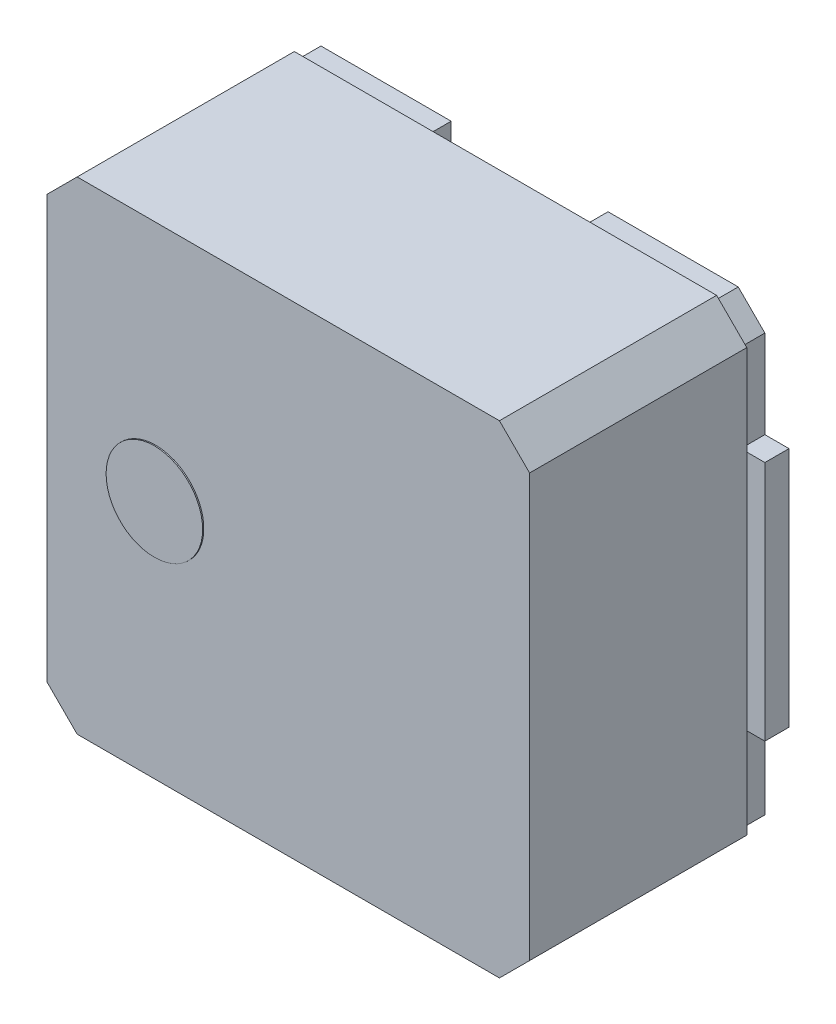
ISO-10303-21;
HEADER;
FILE_DESCRIPTION(('STEP AP214'),'2;1');
FILE_NAME('part.step','',(''),(''),'','','');
FILE_SCHEMA(('AUTOMOTIVE_DESIGN { 1 0 10303 214 1 1 1 1 }'));
ENDSEC;
DATA;
#1=APPLICATION_CONTEXT('core data for automotive mechanical design processes');
#2=APPLICATION_PROTOCOL_DEFINITION('international standard','automotive_design',2000,#1);
#3=PRODUCT_CONTEXT('',#1,'mechanical');
#4=PRODUCT('Part','Part','',(#3));
#5=PRODUCT_RELATED_PRODUCT_CATEGORY('part','',(#4));
#6=PRODUCT_DEFINITION_FORMATION('','',#4);
#7=PRODUCT_DEFINITION_CONTEXT('part definition',#1,'design');
#8=PRODUCT_DEFINITION('design','',#6,#7);
#9=PRODUCT_DEFINITION_SHAPE('','',#8);
#10=(LENGTH_UNIT() NAMED_UNIT(*) SI_UNIT(.MILLI.,.METRE.));
#11=(NAMED_UNIT(*) PLANE_ANGLE_UNIT() SI_UNIT($,.RADIAN.));
#12=(NAMED_UNIT(*) SI_UNIT($,.STERADIAN.) SOLID_ANGLE_UNIT());
#13=UNCERTAINTY_MEASURE_WITH_UNIT(LENGTH_MEASURE(1.E-05),#10,'distance_accuracy_value','');
#14=(GEOMETRIC_REPRESENTATION_CONTEXT(3) GLOBAL_UNCERTAINTY_ASSIGNED_CONTEXT((#13)) GLOBAL_UNIT_ASSIGNED_CONTEXT((#10,
#11,#12)) REPRESENTATION_CONTEXT('',''));
#15=CARTESIAN_POINT('',(0.,0.,0.));
#16=DIRECTION('',(0.,0.,1.));
#17=DIRECTION('',(1.,0.,0.));
#18=AXIS2_PLACEMENT_3D('',#15,#16,#17);
#19=CARTESIAN_POINT('',(0.,0.,0.2));
#20=DIRECTION('',(0.,0.,-1.));
#21=DIRECTION('',(-1.,0.,0.));
#22=AXIS2_PLACEMENT_3D('',#19,#20,#21);
#23=PLANE('',#22);
#24=DIRECTION('',(0.,-1.,0.));
#25=VECTOR('',#24,1.);
#26=CARTESIAN_POINT('',(-2.,-1.75,0.2));
#27=LINE('',#26,#25);
#28=CARTESIAN_POINT('',(-2.,-1.,0.2));
#29=VERTEX_POINT('',#28);
#30=CARTESIAN_POINT('',(-2.,-1.75,0.2));
#31=VERTEX_POINT('',#30);
#32=EDGE_CURVE('E408',#29,#31,#27,.T.);
#33=ORIENTED_EDGE('',*,*,#32,.F.);
#34=DIRECTION('',(-1.,0.,0.));
#35=VECTOR('',#34,1.);
#36=CARTESIAN_POINT('',(-2.15,-1.,0.2));
#37=LINE('',#36,#35);
#38=CARTESIAN_POINT('',(-1.95,-1.,0.2));
#39=VERTEX_POINT('',#38);
#40=EDGE_CURVE('E509',#39,#29,#37,.T.);
#41=ORIENTED_EDGE('',*,*,#40,.F.);
#42=DIRECTION('',(0.,1.,0.));
#43=VECTOR('',#42,1.);
#44=CARTESIAN_POINT('',(-1.95,-1.,0.2));
#45=LINE('',#44,#43);
#46=CARTESIAN_POINT('',(-1.95,-1.72928932188135,0.2));
#47=VERTEX_POINT('',#46);
#48=EDGE_CURVE('E540',#47,#39,#45,.T.);
#49=ORIENTED_EDGE('',*,*,#48,.F.);
#50=DIRECTION('',(-0.707106781186548,0.707106781186548,0.));
#51=VECTOR('',#50,1.);
#52=CARTESIAN_POINT('',(-1.95,-1.72928932188135,0.2));
#53=LINE('',#52,#51);
#54=CARTESIAN_POINT('',(-1.72928932188135,-1.95,0.2));
#55=VERTEX_POINT('',#54);
#56=EDGE_CURVE('E537',#55,#47,#53,.T.);
#57=ORIENTED_EDGE('',*,*,#56,.F.);
#58=DIRECTION('',(-1.,0.,0.));
#59=VECTOR('',#58,1.);
#60=CARTESIAN_POINT('',(-1.72928932188135,-1.95,0.2));
#61=LINE('',#60,#59);
#62=CARTESIAN_POINT('',(-0.65,-1.95,0.2));
#63=VERTEX_POINT('',#62);
#64=EDGE_CURVE('E301',#63,#55,#61,.T.);
#65=ORIENTED_EDGE('',*,*,#64,.F.);
#66=DIRECTION('',(0.,-1.,0.));
#67=VECTOR('',#66,1.);
#68=CARTESIAN_POINT('',(-0.65,1.95,0.2));
#69=LINE('',#68,#67);
#70=CARTESIAN_POINT('',(-0.65,1.95,0.2));
#71=VERTEX_POINT('',#70);
#72=EDGE_CURVE('E238',#71,#63,#69,.T.);
#73=ORIENTED_EDGE('',*,*,#72,.F.);
#74=DIRECTION('',(1.,0.,0.));
#75=VECTOR('',#74,1.);
#76=CARTESIAN_POINT('',(-0.65,1.95,0.2));
#77=LINE('',#76,#75);
#78=CARTESIAN_POINT('',(-1.72928932188135,1.95,0.2));
#79=VERTEX_POINT('',#78);
#80=EDGE_CURVE('E259',#79,#71,#77,.T.);
#81=ORIENTED_EDGE('',*,*,#80,.F.);
#82=DIRECTION('',(0.707106781186554,0.707106781186541,0.));
#83=VECTOR('',#82,1.);
#84=CARTESIAN_POINT('',(-1.72928932188135,1.95,0.2));
#85=LINE('',#84,#83);
#86=CARTESIAN_POINT('',(-1.95,1.72928932188134,0.2));
#87=VERTEX_POINT('',#86);
#88=EDGE_CURVE('E50',#87,#79,#85,.T.);
#89=ORIENTED_EDGE('',*,*,#88,.F.);
#90=DIRECTION('',(0.,1.,0.));
#91=VECTOR('',#90,1.);
#92=CARTESIAN_POINT('',(-1.95,1.72928932188134,0.2));
#93=LINE('',#92,#91);
#94=CARTESIAN_POINT('',(-1.95,1.,0.2));
#95=VERTEX_POINT('',#94);
#96=EDGE_CURVE('E523',#95,#87,#93,.T.);
#97=ORIENTED_EDGE('',*,*,#96,.F.);
#98=DIRECTION('',(-1.,0.,0.));
#99=VECTOR('',#98,1.);
#100=CARTESIAN_POINT('',(0.,1.,0.2));
#101=LINE('',#100,#99);
#102=CARTESIAN_POINT('',(-2.,1.,0.2));
#103=VERTEX_POINT('',#102);
#104=EDGE_CURVE('E43',#95,#103,#101,.T.);
#105=ORIENTED_EDGE('',*,*,#104,.T.);
#106=CARTESIAN_POINT('',(-2.,1.75,0.2));
#107=VERTEX_POINT('',#106);
#108=EDGE_CURVE('E409',#107,#103,#27,.T.);
#109=ORIENTED_EDGE('',*,*,#108,.F.);
#110=DIRECTION('',(-0.707106781186554,-0.707106781186541,0.));
#111=VECTOR('',#110,1.);
#112=CARTESIAN_POINT('',(-2.,1.75,0.2));
#113=LINE('',#112,#111);
#114=CARTESIAN_POINT('',(-1.75,2.,0.2));
#115=VERTEX_POINT('',#114);
#116=EDGE_CURVE('E406',#115,#107,#113,.T.);
#117=ORIENTED_EDGE('',*,*,#116,.F.);
#118=DIRECTION('',(-1.,0.,0.));
#119=VECTOR('',#118,1.);
#120=CARTESIAN_POINT('',(1.75,2.,0.2));
#121=LINE('',#120,#119);
#122=CARTESIAN_POINT('',(1.75,2.,0.2));
#123=VERTEX_POINT('',#122);
#124=EDGE_CURVE('E404',#123,#115,#121,.T.);
#125=ORIENTED_EDGE('',*,*,#124,.F.);
#126=DIRECTION('',(-0.707106781186554,0.707106781186541,0.));
#127=VECTOR('',#126,1.);
#128=CARTESIAN_POINT('',(2.,1.75,0.2));
#129=LINE('',#128,#127);
#130=CARTESIAN_POINT('',(2.,1.75,0.2));
#131=VERTEX_POINT('',#130);
#132=EDGE_CURVE('E330',#131,#123,#129,.T.);
#133=ORIENTED_EDGE('',*,*,#132,.F.);
#134=DIRECTION('',(0.,1.,0.));
#135=VECTOR('',#134,1.);
#136=CARTESIAN_POINT('',(2.,-1.75,0.2));
#137=LINE('',#136,#135);
#138=CARTESIAN_POINT('',(2.,1.,0.2));
#139=VERTEX_POINT('',#138);
#140=EDGE_CURVE('E419',#139,#131,#137,.T.);
#141=ORIENTED_EDGE('',*,*,#140,.F.);
#142=DIRECTION('',(1.,0.,0.));
#143=VECTOR('',#142,1.);
#144=CARTESIAN_POINT('',(1.95,1.,0.2));
#145=LINE('',#144,#143);
#146=CARTESIAN_POINT('',(1.95,1.,0.2));
#147=VERTEX_POINT('',#146);
#148=EDGE_CURVE('E307',#147,#139,#145,.T.);
#149=ORIENTED_EDGE('',*,*,#148,.F.);
#150=DIRECTION('',(0.,-1.,0.));
#151=VECTOR('',#150,1.);
#152=CARTESIAN_POINT('',(1.95,1.,0.2));
#153=LINE('',#152,#151);
#154=CARTESIAN_POINT('',(1.95,1.72928932188135,0.2));
#155=VERTEX_POINT('',#154);
#156=EDGE_CURVE('E302',#155,#147,#153,.T.);
#157=ORIENTED_EDGE('',*,*,#156,.F.);
#158=DIRECTION('',(0.707106781186554,-0.707106781186541,0.));
#159=VECTOR('',#158,1.);
#160=CARTESIAN_POINT('',(1.95,1.72928932188135,0.2));
#161=LINE('',#160,#159);
#162=CARTESIAN_POINT('',(1.72928932188135,1.95,0.2));
#163=VERTEX_POINT('',#162);
#164=EDGE_CURVE('E306',#163,#155,#161,.T.);
#165=ORIENTED_EDGE('',*,*,#164,.F.);
#166=DIRECTION('',(1.,0.,0.));
#167=VECTOR('',#166,1.);
#168=CARTESIAN_POINT('',(1.72928932188135,1.95,0.2));
#169=LINE('',#168,#167);
#170=CARTESIAN_POINT('',(0.65,1.95,0.2));
#171=VERTEX_POINT('',#170);
#172=EDGE_CURVE('E327',#171,#163,#169,.T.);
#173=ORIENTED_EDGE('',*,*,#172,.F.);
#174=DIRECTION('',(0.,1.,0.));
#175=VECTOR('',#174,1.);
#176=CARTESIAN_POINT('',(0.65,1.95,0.2));
#177=LINE('',#176,#175);
#178=CARTESIAN_POINT('',(0.65,-1.95,0.2));
#179=VERTEX_POINT('',#178);
#180=EDGE_CURVE('E324',#179,#171,#177,.T.);
#181=ORIENTED_EDGE('',*,*,#180,.F.);
#182=DIRECTION('',(-1.,0.,0.));
#183=VECTOR('',#182,1.);
#184=CARTESIAN_POINT('',(0.65,-1.95,0.2));
#185=LINE('',#184,#183);
#186=CARTESIAN_POINT('',(1.72928932188135,-1.95,0.2));
#187=VERTEX_POINT('',#186);
#188=EDGE_CURVE('E321',#187,#179,#185,.T.);
#189=ORIENTED_EDGE('',*,*,#188,.F.);
#190=DIRECTION('',(-0.707106781186548,-0.707106781186548,0.));
#191=VECTOR('',#190,1.);
#192=CARTESIAN_POINT('',(1.72928932188135,-1.95,0.2));
#193=LINE('',#192,#191);
#194=CARTESIAN_POINT('',(1.95,-1.72928932188135,0.2));
#195=VERTEX_POINT('',#194);
#196=EDGE_CURVE('E318',#195,#187,#193,.T.);
#197=ORIENTED_EDGE('',*,*,#196,.F.);
#198=DIRECTION('',(0.,-1.,0.));
#199=VECTOR('',#198,1.);
#200=CARTESIAN_POINT('',(1.95,-1.72928932188135,0.2));
#201=LINE('',#200,#199);
#202=CARTESIAN_POINT('',(1.95,-1.,0.2));
#203=VERTEX_POINT('',#202);
#204=EDGE_CURVE('E58',#203,#195,#201,.T.);
#205=ORIENTED_EDGE('',*,*,#204,.F.);
#206=DIRECTION('',(-1.,0.,0.));
#207=VECTOR('',#206,1.);
#208=CARTESIAN_POINT('',(2.15,-1.,0.2));
#209=LINE('',#208,#207);
#210=CARTESIAN_POINT('',(2.,-1.,0.2));
#211=VERTEX_POINT('',#210);
#212=EDGE_CURVE('E316',#211,#203,#209,.T.);
#213=ORIENTED_EDGE('',*,*,#212,.F.);
#214=CARTESIAN_POINT('',(2.,-1.75,0.2));
#215=VERTEX_POINT('',#214);
#216=EDGE_CURVE('E387',#215,#211,#137,.T.);
#217=ORIENTED_EDGE('',*,*,#216,.F.);
#218=DIRECTION('',(0.707106781186548,0.707106781186548,0.));
#219=VECTOR('',#218,1.);
#220=CARTESIAN_POINT('',(2.,-1.75,0.2));
#221=LINE('',#220,#219);
#222=CARTESIAN_POINT('',(1.75,-2.,0.2));
#223=VERTEX_POINT('',#222);
#224=EDGE_CURVE('E417',#223,#215,#221,.T.);
#225=ORIENTED_EDGE('',*,*,#224,.F.);
#226=DIRECTION('',(1.,0.,0.));
#227=VECTOR('',#226,1.);
#228=CARTESIAN_POINT('',(1.75,-2.,0.2));
#229=LINE('',#228,#227);
#230=CARTESIAN_POINT('',(-1.75,-2.,0.2));
#231=VERTEX_POINT('',#230);
#232=EDGE_CURVE('E415',#231,#223,#229,.T.);
#233=ORIENTED_EDGE('',*,*,#232,.F.);
#234=DIRECTION('',(0.707106781186548,-0.707106781186548,0.));
#235=VECTOR('',#234,1.);
#236=CARTESIAN_POINT('',(-2.,-1.75,0.2));
#237=LINE('',#236,#235);
#238=EDGE_CURVE('E412',#31,#231,#237,.T.);
#239=ORIENTED_EDGE('',*,*,#238,.F.);
#240=EDGE_LOOP('',(#33,#41,#49,#57,#65,#73,#81,#89,#97,#105,#109,#117,#125,#133,#141,#149,#157,
#165,#173,#181,#189,#197,#205,#213,#217,#225,#233,#239));
#241=FACE_BOUND('',#240,.T.);
#242=ADVANCED_FACE('F35',(#241),#23,.T.);
#243=CARTESIAN_POINT('',(2.,1.75,2.));
#244=DIRECTION('',(-0.707106781186541,-0.707106781186554,0.));
#245=DIRECTION('',(0.707106781186554,-0.707106781186541,0.));
#246=AXIS2_PLACEMENT_3D('',#243,#244,#245);
#247=PLANE('',#246);
#248=ORIENTED_EDGE('',*,*,#132,.T.);
#249=DIRECTION('',(0.,0.,-1.));
#250=VECTOR('',#249,1.);
#251=CARTESIAN_POINT('',(1.75,2.,2.));
#252=LINE('',#251,#250);
#253=CARTESIAN_POINT('',(1.75,2.,2.));
#254=VERTEX_POINT('',#253);
#255=EDGE_CURVE('E443',#254,#123,#252,.T.);
#256=ORIENTED_EDGE('',*,*,#255,.F.);
#257=DIRECTION('',(-0.707106781186554,0.707106781186541,0.));
#258=VECTOR('',#257,1.);
#259=CARTESIAN_POINT('',(2.,1.75,2.));
#260=LINE('',#259,#258);
#261=CARTESIAN_POINT('',(2.,1.75,2.));
#262=VERTEX_POINT('',#261);
#263=EDGE_CURVE('E383',#262,#254,#260,.T.);
#264=ORIENTED_EDGE('',*,*,#263,.F.);
#265=DIRECTION('',(0.,0.,-1.));
#266=VECTOR('',#265,1.);
#267=CARTESIAN_POINT('',(2.,1.75,2.));
#268=LINE('',#267,#266);
#269=EDGE_CURVE('E401',#262,#131,#268,.T.);
#270=ORIENTED_EDGE('',*,*,#269,.T.);
#271=EDGE_LOOP('',(#248,#256,#264,#270));
#272=FACE_BOUND('',#271,.T.);
#273=ADVANCED_FACE('F37',(#272),#247,.F.);
#274=CARTESIAN_POINT('',(1.75,2.,2.));
#275=DIRECTION('',(0.,-1.,0.));
#276=DIRECTION('',(0.,0.,-1.));
#277=AXIS2_PLACEMENT_3D('',#274,#275,#276);
#278=PLANE('',#277);
#279=ORIENTED_EDGE('',*,*,#124,.T.);
#280=DIRECTION('',(0.,0.,-1.));
#281=VECTOR('',#280,1.);
#282=CARTESIAN_POINT('',(-1.75,2.,2.));
#283=LINE('',#282,#281);
#284=CARTESIAN_POINT('',(-1.75,2.,2.));
#285=VERTEX_POINT('',#284);
#286=EDGE_CURVE('E440',#285,#115,#283,.T.);
#287=ORIENTED_EDGE('',*,*,#286,.F.);
#288=DIRECTION('',(-1.,0.,0.));
#289=VECTOR('',#288,1.);
#290=CARTESIAN_POINT('',(1.75,2.,2.));
#291=LINE('',#290,#289);
#292=EDGE_CURVE('E386',#254,#285,#291,.T.);
#293=ORIENTED_EDGE('',*,*,#292,.F.);
#294=ORIENTED_EDGE('',*,*,#255,.T.);
#295=EDGE_LOOP('',(#279,#287,#293,#294));
#296=FACE_BOUND('',#295,.T.);
#297=ADVANCED_FACE('F485',(#296),#278,.F.);
#298=CARTESIAN_POINT('',(-2.,1.75,2.));
#299=DIRECTION('',(0.707106781186541,-0.707106781186554,0.));
#300=DIRECTION('',(0.707106781186554,0.707106781186541,0.));
#301=AXIS2_PLACEMENT_3D('',#298,#299,#300);
#302=PLANE('',#301);
#303=ORIENTED_EDGE('',*,*,#116,.T.);
#304=DIRECTION('',(0.,0.,-1.));
#305=VECTOR('',#304,1.);
#306=CARTESIAN_POINT('',(-2.,1.75,2.));
#307=LINE('',#306,#305);
#308=CARTESIAN_POINT('',(-2.,1.75,2.));
#309=VERTEX_POINT('',#308);
#310=EDGE_CURVE('E437',#309,#107,#307,.T.);
#311=ORIENTED_EDGE('',*,*,#310,.F.);
#312=DIRECTION('',(-0.707106781186554,-0.707106781186541,0.));
#313=VECTOR('',#312,1.);
#314=CARTESIAN_POINT('',(-2.,1.75,2.));
#315=LINE('',#314,#313);
#316=EDGE_CURVE('E389',#285,#309,#315,.T.);
#317=ORIENTED_EDGE('',*,*,#316,.F.);
#318=ORIENTED_EDGE('',*,*,#286,.T.);
#319=EDGE_LOOP('',(#303,#311,#317,#318));
#320=FACE_BOUND('',#319,.T.);
#321=ADVANCED_FACE('F585',(#320),#302,.F.);
#322=CARTESIAN_POINT('',(-2.,-1.75,2.));
#323=DIRECTION('',(1.,0.,0.));
#324=DIRECTION('',(0.,1.,0.));
#325=AXIS2_PLACEMENT_3D('',#322,#323,#324);
#326=PLANE('',#325);
#327=ORIENTED_EDGE('',*,*,#108,.T.);
#328=EDGE_CURVE('E413',#103,#29,#27,.T.);
#329=ORIENTED_EDGE('',*,*,#328,.T.);
#330=ORIENTED_EDGE('',*,*,#32,.T.);
#331=DIRECTION('',(0.,0.,-1.));
#332=VECTOR('',#331,1.);
#333=CARTESIAN_POINT('',(-2.,-1.75,2.));
#334=LINE('',#333,#332);
#335=CARTESIAN_POINT('',(-2.,-1.75,2.));
#336=VERTEX_POINT('',#335);
#337=EDGE_CURVE('E434',#336,#31,#334,.T.);
#338=ORIENTED_EDGE('',*,*,#337,.F.);
#339=DIRECTION('',(0.,-1.,0.));
#340=VECTOR('',#339,1.);
#341=CARTESIAN_POINT('',(-2.,-1.75,2.));
#342=LINE('',#341,#340);
#343=EDGE_CURVE('E391',#309,#336,#342,.T.);
#344=ORIENTED_EDGE('',*,*,#343,.F.);
#345=ORIENTED_EDGE('',*,*,#310,.T.);
#346=EDGE_LOOP('',(#327,#329,#330,#338,#344,#345));
#347=FACE_BOUND('',#346,.T.);
#348=ADVANCED_FACE('F511',(#347),#326,.F.);
#349=CARTESIAN_POINT('',(-2.,-1.75,2.));
#350=DIRECTION('',(0.707106781186547,0.707106781186547,0.));
#351=DIRECTION('',(-0.707106781186548,0.707106781186548,0.));
#352=AXIS2_PLACEMENT_3D('',#349,#350,#351);
#353=PLANE('',#352);
#354=ORIENTED_EDGE('',*,*,#238,.T.);
#355=DIRECTION('',(0.,0.,-1.));
#356=VECTOR('',#355,1.);
#357=CARTESIAN_POINT('',(-1.75,-2.,2.));
#358=LINE('',#357,#356);
#359=CARTESIAN_POINT('',(-1.75,-2.,2.));
#360=VERTEX_POINT('',#359);
#361=EDGE_CURVE('E431',#360,#231,#358,.T.);
#362=ORIENTED_EDGE('',*,*,#361,.F.);
#363=DIRECTION('',(0.707106781186548,-0.707106781186548,0.));
#364=VECTOR('',#363,1.);
#365=CARTESIAN_POINT('',(-2.,-1.75,2.));
#366=LINE('',#365,#364);
#367=EDGE_CURVE('E393',#336,#360,#366,.T.);
#368=ORIENTED_EDGE('',*,*,#367,.F.);
#369=ORIENTED_EDGE('',*,*,#337,.T.);
#370=EDGE_LOOP('',(#354,#362,#368,#369));
#371=FACE_BOUND('',#370,.T.);
#372=ADVANCED_FACE('F503',(#371),#353,.F.);
#373=CARTESIAN_POINT('',(1.75,-2.,2.));
#374=DIRECTION('',(0.,1.,0.));
#375=DIRECTION('',(0.,0.,1.));
#376=AXIS2_PLACEMENT_3D('',#373,#374,#375);
#377=PLANE('',#376);
#378=ORIENTED_EDGE('',*,*,#232,.T.);
#379=DIRECTION('',(0.,0.,-1.));
#380=VECTOR('',#379,1.);
#381=CARTESIAN_POINT('',(1.75,-2.,2.));
#382=LINE('',#381,#380);
#383=CARTESIAN_POINT('',(1.75,-2.,2.));
#384=VERTEX_POINT('',#383);
#385=EDGE_CURVE('E428',#384,#223,#382,.T.);
#386=ORIENTED_EDGE('',*,*,#385,.F.);
#387=DIRECTION('',(1.,0.,0.));
#388=VECTOR('',#387,1.);
#389=CARTESIAN_POINT('',(1.75,-2.,2.));
#390=LINE('',#389,#388);
#391=EDGE_CURVE('E395',#360,#384,#390,.T.);
#392=ORIENTED_EDGE('',*,*,#391,.F.);
#393=ORIENTED_EDGE('',*,*,#361,.T.);
#394=EDGE_LOOP('',(#378,#386,#392,#393));
#395=FACE_BOUND('',#394,.T.);
#396=ADVANCED_FACE('F499',(#395),#377,.F.);
#397=CARTESIAN_POINT('',(2.,-1.75,2.));
#398=DIRECTION('',(-0.707106781186547,0.707106781186547,0.));
#399=DIRECTION('',(-0.707106781186548,-0.707106781186548,0.));
#400=AXIS2_PLACEMENT_3D('',#397,#398,#399);
#401=PLANE('',#400);
#402=ORIENTED_EDGE('',*,*,#224,.T.);
#403=DIRECTION('',(0.,0.,-1.));
#404=VECTOR('',#403,1.);
#405=CARTESIAN_POINT('',(2.,-1.75,2.));
#406=LINE('',#405,#404);
#407=CARTESIAN_POINT('',(2.,-1.75,2.));
#408=VERTEX_POINT('',#407);
#409=EDGE_CURVE('E425',#408,#215,#406,.T.);
#410=ORIENTED_EDGE('',*,*,#409,.F.);
#411=DIRECTION('',(0.707106781186548,0.707106781186548,0.));
#412=VECTOR('',#411,1.);
#413=CARTESIAN_POINT('',(2.,-1.75,2.));
#414=LINE('',#413,#412);
#415=EDGE_CURVE('E397',#384,#408,#414,.T.);
#416=ORIENTED_EDGE('',*,*,#415,.F.);
#417=ORIENTED_EDGE('',*,*,#385,.T.);
#418=EDGE_LOOP('',(#402,#410,#416,#417));
#419=FACE_BOUND('',#418,.T.);
#420=ADVANCED_FACE('F495',(#419),#401,.F.);
#421=CARTESIAN_POINT('',(2.,-1.75,2.));
#422=DIRECTION('',(-1.,0.,0.));
#423=DIRECTION('',(0.,-1.,0.));
#424=AXIS2_PLACEMENT_3D('',#421,#422,#423);
#425=PLANE('',#424);
#426=ORIENTED_EDGE('',*,*,#216,.T.);
#427=EDGE_CURVE('E422',#211,#139,#137,.T.);
#428=ORIENTED_EDGE('',*,*,#427,.T.);
#429=ORIENTED_EDGE('',*,*,#140,.T.);
#430=ORIENTED_EDGE('',*,*,#269,.F.);
#431=DIRECTION('',(0.,1.,0.));
#432=VECTOR('',#431,1.);
#433=CARTESIAN_POINT('',(2.,-1.75,2.));
#434=LINE('',#433,#432);
#435=EDGE_CURVE('E399',#408,#262,#434,.T.);
#436=ORIENTED_EDGE('',*,*,#435,.F.);
#437=ORIENTED_EDGE('',*,*,#409,.T.);
#438=EDGE_LOOP('',(#426,#428,#429,#430,#436,#437));
#439=FACE_BOUND('',#438,.T.);
#440=ADVANCED_FACE('F475',(#439),#425,.F.);
#441=CARTESIAN_POINT('',(0.,0.,2.));
#442=DIRECTION('',(0.,0.,-1.));
#443=DIRECTION('',(-1.,0.,0.));
#444=AXIS2_PLACEMENT_3D('',#441,#442,#443);
#445=PLANE('',#444);
#446=CARTESIAN_POINT('',(-1.1,0.,2.));
#447=DIRECTION('',(0.,0.,-1.));
#448=DIRECTION('',(-1.,0.,0.));
#449=AXIS2_PLACEMENT_3D('',#446,#447,#448);
#450=CIRCLE('',#449,0.4);
#451=CARTESIAN_POINT('',(-1.5,0.,2.));
#452=VERTEX_POINT('',#451);
#453=EDGE_CURVE('E11',#452,#452,#450,.F.);
#454=ORIENTED_EDGE('',*,*,#453,.F.);
#455=EDGE_LOOP('',(#454));
#456=FACE_BOUND('',#455,.T.);
#457=ORIENTED_EDGE('',*,*,#263,.T.);
#458=ORIENTED_EDGE('',*,*,#292,.T.);
#459=ORIENTED_EDGE('',*,*,#316,.T.);
#460=ORIENTED_EDGE('',*,*,#343,.T.);
#461=ORIENTED_EDGE('',*,*,#367,.T.);
#462=ORIENTED_EDGE('',*,*,#391,.T.);
#463=ORIENTED_EDGE('',*,*,#415,.T.);
#464=ORIENTED_EDGE('',*,*,#435,.T.);
#465=EDGE_LOOP('',(#457,#458,#459,#460,#461,#462,#463,#464));
#466=FACE_BOUND('',#465,.T.);
#467=ADVANCED_FACE('F488',(#456,#466),#445,.F.);
#468=CARTESIAN_POINT('',(0.,0.,0.));
#469=DIRECTION('',(0.,0.,1.));
#470=DIRECTION('',(1.,0.,0.));
#471=AXIS2_PLACEMENT_3D('',#468,#469,#470);
#472=PLANE('',#471);
#473=DIRECTION('',(-1.,0.,0.));
#474=VECTOR('',#473,1.);
#475=CARTESIAN_POINT('',(1.72928932188135,1.95,0.));
#476=LINE('',#475,#474);
#477=CARTESIAN_POINT('',(1.72928932188135,1.95,0.));
#478=VERTEX_POINT('',#477);
#479=CARTESIAN_POINT('',(0.65,1.95,0.));
#480=VERTEX_POINT('',#479);
#481=EDGE_CURVE('E331',#478,#480,#476,.T.);
#482=ORIENTED_EDGE('',*,*,#481,.F.);
#483=DIRECTION('',(-0.707106781186554,0.70710678118654,0.));
#484=VECTOR('',#483,1.);
#485=CARTESIAN_POINT('',(1.95,1.72928932188135,0.));
#486=LINE('',#485,#484);
#487=CARTESIAN_POINT('',(1.95,1.72928932188135,0.));
#488=VERTEX_POINT('',#487);
#489=EDGE_CURVE('E358',#488,#478,#486,.T.);
#490=ORIENTED_EDGE('',*,*,#489,.F.);
#491=DIRECTION('',(0.,1.,0.));
#492=VECTOR('',#491,1.);
#493=CARTESIAN_POINT('',(1.95,1.,0.));
#494=LINE('',#493,#492);
#495=CARTESIAN_POINT('',(1.95,1.,0.));
#496=VERTEX_POINT('',#495);
#497=EDGE_CURVE('E355',#496,#488,#494,.T.);
#498=ORIENTED_EDGE('',*,*,#497,.F.);
#499=DIRECTION('',(-1.,0.,0.));
#500=VECTOR('',#499,1.);
#501=CARTESIAN_POINT('',(1.95,1.,0.));
#502=LINE('',#501,#500);
#503=CARTESIAN_POINT('',(2.15,1.,0.));
#504=VERTEX_POINT('',#503);
#505=EDGE_CURVE('E352',#504,#496,#502,.T.);
#506=ORIENTED_EDGE('',*,*,#505,.F.);
#507=DIRECTION('',(0.,1.,0.));
#508=VECTOR('',#507,1.);
#509=CARTESIAN_POINT('',(2.15,1.,0.));
#510=LINE('',#509,#508);
#511=CARTESIAN_POINT('',(2.15,-1.,0.));
#512=VERTEX_POINT('',#511);
#513=EDGE_CURVE('E349',#512,#504,#510,.T.);
#514=ORIENTED_EDGE('',*,*,#513,.F.);
#515=DIRECTION('',(1.,0.,0.));
#516=VECTOR('',#515,1.);
#517=CARTESIAN_POINT('',(2.15,-1.,0.));
#518=LINE('',#517,#516);
#519=CARTESIAN_POINT('',(1.95,-1.,0.));
#520=VERTEX_POINT('',#519);
#521=EDGE_CURVE('E346',#520,#512,#518,.T.);
#522=ORIENTED_EDGE('',*,*,#521,.F.);
#523=DIRECTION('',(0.,1.,0.));
#524=VECTOR('',#523,1.);
#525=CARTESIAN_POINT('',(1.95,-1.72928932188135,0.));
#526=LINE('',#525,#524);
#527=CARTESIAN_POINT('',(1.95,-1.72928932188135,0.));
#528=VERTEX_POINT('',#527);
#529=EDGE_CURVE('E343',#528,#520,#526,.T.);
#530=ORIENTED_EDGE('',*,*,#529,.F.);
#531=DIRECTION('',(0.707106781186548,0.707106781186548,0.));
#532=VECTOR('',#531,1.);
#533=CARTESIAN_POINT('',(1.72928932188135,-1.95,0.));
#534=LINE('',#533,#532);
#535=CARTESIAN_POINT('',(1.72928932188135,-1.95,0.));
#536=VERTEX_POINT('',#535);
#537=EDGE_CURVE('E340',#536,#528,#534,.T.);
#538=ORIENTED_EDGE('',*,*,#537,.F.);
#539=DIRECTION('',(1.,0.,0.));
#540=VECTOR('',#539,1.);
#541=CARTESIAN_POINT('',(0.65,-1.95,0.));
#542=LINE('',#541,#540);
#543=CARTESIAN_POINT('',(0.65,-1.95,0.));
#544=VERTEX_POINT('',#543);
#545=EDGE_CURVE('E337',#544,#536,#542,.T.);
#546=ORIENTED_EDGE('',*,*,#545,.F.);
#547=DIRECTION('',(0.,-1.,0.));
#548=VECTOR('',#547,1.);
#549=CARTESIAN_POINT('',(0.65,1.95,0.));
#550=LINE('',#549,#548);
#551=EDGE_CURVE('E334',#480,#544,#550,.T.);
#552=ORIENTED_EDGE('',*,*,#551,.F.);
#553=EDGE_LOOP('',(#482,#490,#498,#506,#514,#522,#530,#538,#546,#552));
#554=FACE_BOUND('',#553,.T.);
#555=ADVANCED_FACE('F462',(#554),#472,.F.);
#556=CARTESIAN_POINT('',(1.95,1.72928932188135,4.37851648315524));
#557=DIRECTION('',(-0.707106781186541,-0.707106781186554,0.));
#558=DIRECTION('',(0.707106781186554,-0.707106781186541,0.));
#559=AXIS2_PLACEMENT_3D('',#556,#557,#558);
#560=PLANE('',#559);
#561=DIRECTION('',(0.,0.,-1.));
#562=VECTOR('',#561,1.);
#563=CARTESIAN_POINT('',(1.72928932188135,1.95,4.37851648315524));
#564=LINE('',#563,#562);
#565=EDGE_CURVE('E361',#163,#478,#564,.T.);
#566=ORIENTED_EDGE('',*,*,#565,.F.);
#567=ORIENTED_EDGE('',*,*,#164,.T.);
#568=DIRECTION('',(0.,0.,-1.));
#569=VECTOR('',#568,1.);
#570=CARTESIAN_POINT('',(1.95,1.72928932188135,4.37851648315524));
#571=LINE('',#570,#569);
#572=EDGE_CURVE('E363',#155,#488,#571,.T.);
#573=ORIENTED_EDGE('',*,*,#572,.T.);
#574=ORIENTED_EDGE('',*,*,#489,.T.);
#575=EDGE_LOOP('',(#566,#567,#573,#574));
#576=FACE_BOUND('',#575,.T.);
#577=ADVANCED_FACE('F631',(#576),#560,.F.);
#578=CARTESIAN_POINT('',(1.95,1.,4.37851648315524));
#579=DIRECTION('',(-1.,0.,0.));
#580=DIRECTION('',(0.,0.,1.));
#581=AXIS2_PLACEMENT_3D('',#578,#579,#580);
#582=PLANE('',#581);
#583=ORIENTED_EDGE('',*,*,#572,.F.);
#584=ORIENTED_EDGE('',*,*,#156,.T.);
#585=DIRECTION('',(0.,0.,-1.));
#586=VECTOR('',#585,1.);
#587=CARTESIAN_POINT('',(1.95,1.,4.37851648315524));
#588=LINE('',#587,#586);
#589=EDGE_CURVE('E365',#147,#496,#588,.T.);
#590=ORIENTED_EDGE('',*,*,#589,.T.);
#591=ORIENTED_EDGE('',*,*,#497,.T.);
#592=EDGE_LOOP('',(#583,#584,#590,#591));
#593=FACE_BOUND('',#592,.T.);
#594=ADVANCED_FACE('F638',(#593),#582,.F.);
#595=CARTESIAN_POINT('',(1.95,1.,4.37851648315524));
#596=DIRECTION('',(0.,-1.,0.));
#597=DIRECTION('',(0.,0.,-1.));
#598=AXIS2_PLACEMENT_3D('',#595,#596,#597);
#599=PLANE('',#598);
#600=ORIENTED_EDGE('',*,*,#589,.F.);
#601=ORIENTED_EDGE('',*,*,#148,.T.);
#602=CARTESIAN_POINT('',(2.15,1.,0.2));
#603=VERTEX_POINT('',#602);
#604=EDGE_CURVE('E305',#139,#603,#145,.T.);
#605=ORIENTED_EDGE('',*,*,#604,.T.);
#606=DIRECTION('',(0.,0.,-1.));
#607=VECTOR('',#606,1.);
#608=CARTESIAN_POINT('',(2.15,1.,4.37851648315524));
#609=LINE('',#608,#607);
#610=EDGE_CURVE('E367',#603,#504,#609,.T.);
#611=ORIENTED_EDGE('',*,*,#610,.T.);
#612=ORIENTED_EDGE('',*,*,#505,.T.);
#613=EDGE_LOOP('',(#600,#601,#605,#611,#612));
#614=FACE_BOUND('',#613,.T.);
#615=ADVANCED_FACE('F646',(#614),#599,.F.);
#616=CARTESIAN_POINT('',(2.15,1.,4.37851648315524));
#617=DIRECTION('',(-1.,0.,0.));
#618=DIRECTION('',(0.,0.,1.));
#619=AXIS2_PLACEMENT_3D('',#616,#617,#618);
#620=PLANE('',#619);
#621=ORIENTED_EDGE('',*,*,#610,.F.);
#622=DIRECTION('',(0.,-1.,0.));
#623=VECTOR('',#622,1.);
#624=CARTESIAN_POINT('',(2.15,1.,0.2));
#625=LINE('',#624,#623);
#626=CARTESIAN_POINT('',(2.15,-1.,0.2));
#627=VERTEX_POINT('',#626);
#628=EDGE_CURVE('E310',#603,#627,#625,.T.);
#629=ORIENTED_EDGE('',*,*,#628,.T.);
#630=DIRECTION('',(0.,0.,-1.));
#631=VECTOR('',#630,1.);
#632=CARTESIAN_POINT('',(2.15,-1.,4.37851648315524));
#633=LINE('',#632,#631);
#634=EDGE_CURVE('E369',#627,#512,#633,.T.);
#635=ORIENTED_EDGE('',*,*,#634,.T.);
#636=ORIENTED_EDGE('',*,*,#513,.T.);
#637=EDGE_LOOP('',(#621,#629,#635,#636));
#638=FACE_BOUND('',#637,.T.);
#639=ADVANCED_FACE('F467',(#638),#620,.F.);
#640=CARTESIAN_POINT('',(2.15,-1.,4.37851648315524));
#641=DIRECTION('',(0.,1.,0.));
#642=DIRECTION('',(0.,0.,1.));
#643=AXIS2_PLACEMENT_3D('',#640,#641,#642);
#644=PLANE('',#643);
#645=ORIENTED_EDGE('',*,*,#634,.F.);
#646=EDGE_CURVE('E313',#627,#211,#209,.T.);
#647=ORIENTED_EDGE('',*,*,#646,.T.);
#648=ORIENTED_EDGE('',*,*,#212,.T.);
#649=DIRECTION('',(0.,0.,-1.));
#650=VECTOR('',#649,1.);
#651=CARTESIAN_POINT('',(1.95,-1.,4.37851648315524));
#652=LINE('',#651,#650);
#653=EDGE_CURVE('E371',#203,#520,#652,.T.);
#654=ORIENTED_EDGE('',*,*,#653,.T.);
#655=ORIENTED_EDGE('',*,*,#521,.T.);
#656=EDGE_LOOP('',(#645,#647,#648,#654,#655));
#657=FACE_BOUND('',#656,.T.);
#658=ADVANCED_FACE('F451',(#657),#644,.F.);
#659=CARTESIAN_POINT('',(1.95,-1.72928932188135,4.37851648315524));
#660=DIRECTION('',(-1.,0.,0.));
#661=DIRECTION('',(0.,-1.,0.));
#662=AXIS2_PLACEMENT_3D('',#659,#660,#661);
#663=PLANE('',#662);
#664=ORIENTED_EDGE('',*,*,#653,.F.);
#665=ORIENTED_EDGE('',*,*,#204,.T.);
#666=DIRECTION('',(0.,0.,-1.));
#667=VECTOR('',#666,1.);
#668=CARTESIAN_POINT('',(1.95,-1.72928932188135,4.37851648315524));
#669=LINE('',#668,#667);
#670=EDGE_CURVE('E373',#195,#528,#669,.T.);
#671=ORIENTED_EDGE('',*,*,#670,.T.);
#672=ORIENTED_EDGE('',*,*,#529,.T.);
#673=EDGE_LOOP('',(#664,#665,#671,#672));
#674=FACE_BOUND('',#673,.T.);
#675=ADVANCED_FACE('F454',(#674),#663,.F.);
#676=CARTESIAN_POINT('',(1.72928932188135,-1.95,4.37851648315524));
#677=DIRECTION('',(-0.707106781186548,0.707106781186548,0.));
#678=DIRECTION('',(-0.707106781186548,-0.707106781186548,0.));
#679=AXIS2_PLACEMENT_3D('',#676,#677,#678);
#680=PLANE('',#679);
#681=ORIENTED_EDGE('',*,*,#670,.F.);
#682=ORIENTED_EDGE('',*,*,#196,.T.);
#683=DIRECTION('',(0.,0.,-1.));
#684=VECTOR('',#683,1.);
#685=CARTESIAN_POINT('',(1.72928932188135,-1.95,4.37851648315524));
#686=LINE('',#685,#684);
#687=EDGE_CURVE('E375',#187,#536,#686,.T.);
#688=ORIENTED_EDGE('',*,*,#687,.T.);
#689=ORIENTED_EDGE('',*,*,#537,.T.);
#690=EDGE_LOOP('',(#681,#682,#688,#689));
#691=FACE_BOUND('',#690,.T.);
#692=ADVANCED_FACE('F673',(#691),#680,.F.);
#693=CARTESIAN_POINT('',(0.65,-1.95,4.37851648315524));
#694=DIRECTION('',(0.,1.,0.));
#695=DIRECTION('',(-1.,0.,0.));
#696=AXIS2_PLACEMENT_3D('',#693,#694,#695);
#697=PLANE('',#696);
#698=ORIENTED_EDGE('',*,*,#687,.F.);
#699=ORIENTED_EDGE('',*,*,#188,.T.);
#700=DIRECTION('',(0.,0.,-1.));
#701=VECTOR('',#700,1.);
#702=CARTESIAN_POINT('',(0.65,-1.95,4.37851648315524));
#703=LINE('',#702,#701);
#704=EDGE_CURVE('E377',#179,#544,#703,.T.);
#705=ORIENTED_EDGE('',*,*,#704,.T.);
#706=ORIENTED_EDGE('',*,*,#545,.T.);
#707=EDGE_LOOP('',(#698,#699,#705,#706));
#708=FACE_BOUND('',#707,.T.);
#709=ADVANCED_FACE('F680',(#708),#697,.F.);
#710=CARTESIAN_POINT('',(0.65,1.95,4.37851648315524));
#711=DIRECTION('',(1.,0.,0.));
#712=DIRECTION('',(0.,1.,0.));
#713=AXIS2_PLACEMENT_3D('',#710,#711,#712);
#714=PLANE('',#713);
#715=ORIENTED_EDGE('',*,*,#704,.F.);
#716=ORIENTED_EDGE('',*,*,#180,.T.);
#717=DIRECTION('',(0.,0.,-1.));
#718=VECTOR('',#717,1.);
#719=CARTESIAN_POINT('',(0.65,1.95,4.37851648315524));
#720=LINE('',#719,#718);
#721=EDGE_CURVE('E379',#171,#480,#720,.T.);
#722=ORIENTED_EDGE('',*,*,#721,.T.);
#723=ORIENTED_EDGE('',*,*,#551,.T.);
#724=EDGE_LOOP('',(#715,#716,#722,#723));
#725=FACE_BOUND('',#724,.T.);
#726=ADVANCED_FACE('F688',(#725),#714,.F.);
#727=CARTESIAN_POINT('',(1.72928932188135,1.95,4.37851648315524));
#728=DIRECTION('',(0.,-1.,0.));
#729=DIRECTION('',(1.,0.,0.));
#730=AXIS2_PLACEMENT_3D('',#727,#728,#729);
#731=PLANE('',#730);
#732=ORIENTED_EDGE('',*,*,#721,.F.);
#733=ORIENTED_EDGE('',*,*,#172,.T.);
#734=ORIENTED_EDGE('',*,*,#565,.T.);
#735=ORIENTED_EDGE('',*,*,#481,.T.);
#736=EDGE_LOOP('',(#732,#733,#734,#735));
#737=FACE_BOUND('',#736,.T.);
#738=ADVANCED_FACE('F696',(#737),#731,.F.);
#739=CARTESIAN_POINT('',(0.,0.,0.2));
#740=DIRECTION('',(0.,0.,-1.));
#741=DIRECTION('',(-1.,0.,0.));
#742=AXIS2_PLACEMENT_3D('',#739,#740,#741);
#743=PLANE('',#742);
#744=ORIENTED_EDGE('',*,*,#427,.F.);
#745=ORIENTED_EDGE('',*,*,#646,.F.);
#746=ORIENTED_EDGE('',*,*,#628,.F.);
#747=ORIENTED_EDGE('',*,*,#604,.F.);
#748=EDGE_LOOP('',(#744,#745,#746,#747));
#749=FACE_BOUND('',#748,.T.);
#750=ADVANCED_FACE('F471',(#749),#743,.F.);
#751=CARTESIAN_POINT('',(0.,0.,0.2));
#752=DIRECTION('',(0.,0.,-1.));
#753=DIRECTION('',(-1.,0.,0.));
#754=AXIS2_PLACEMENT_3D('',#751,#752,#753);
#755=PLANE('',#754);
#756=CARTESIAN_POINT('',(-2.15,-1.,0.2));
#757=VERTEX_POINT('',#756);
#758=EDGE_CURVE('E518',#29,#757,#37,.T.);
#759=ORIENTED_EDGE('',*,*,#758,.F.);
#760=ORIENTED_EDGE('',*,*,#328,.F.);
#761=DIRECTION('',(1.,0.,0.));
#762=VECTOR('',#761,1.);
#763=CARTESIAN_POINT('',(-1.95,1.,0.2));
#764=LINE('',#763,#762);
#765=CARTESIAN_POINT('',(-2.15,1.,0.2));
#766=VERTEX_POINT('',#765);
#767=EDGE_CURVE('E516',#766,#103,#764,.T.);
#768=ORIENTED_EDGE('',*,*,#767,.F.);
#769=DIRECTION('',(0.,1.,0.));
#770=VECTOR('',#769,1.);
#771=CARTESIAN_POINT('',(-2.15,1.,0.2));
#772=LINE('',#771,#770);
#773=EDGE_CURVE('E524',#757,#766,#772,.T.);
#774=ORIENTED_EDGE('',*,*,#773,.F.);
#775=EDGE_LOOP('',(#759,#760,#768,#774));
#776=FACE_BOUND('',#775,.T.);
#777=ADVANCED_FACE('F514',(#776),#755,.F.);
#778=CARTESIAN_POINT('',(0.,0.,0.));
#779=DIRECTION('',(0.,0.,1.));
#780=DIRECTION('',(1.,0.,0.));
#781=AXIS2_PLACEMENT_3D('',#778,#779,#780);
#782=PLANE('',#781);
#783=DIRECTION('',(-1.,0.,0.));
#784=VECTOR('',#783,1.);
#785=CARTESIAN_POINT('',(-0.65,1.95,0.));
#786=LINE('',#785,#784);
#787=CARTESIAN_POINT('',(-0.65,1.95,0.));
#788=VERTEX_POINT('',#787);
#789=CARTESIAN_POINT('',(-1.72928932188135,1.95,0.));
#790=VERTEX_POINT('',#789);
#791=EDGE_CURVE('E245',#788,#790,#786,.T.);
#792=ORIENTED_EDGE('',*,*,#791,.F.);
#793=DIRECTION('',(0.,1.,0.));
#794=VECTOR('',#793,1.);
#795=CARTESIAN_POINT('',(-0.65,1.95,0.));
#796=LINE('',#795,#794);
#797=CARTESIAN_POINT('',(-0.65,-1.95,0.));
#798=VERTEX_POINT('',#797);
#799=EDGE_CURVE('E281',#798,#788,#796,.T.);
#800=ORIENTED_EDGE('',*,*,#799,.F.);
#801=DIRECTION('',(1.,0.,0.));
#802=VECTOR('',#801,1.);
#803=CARTESIAN_POINT('',(-1.72928932188135,-1.95,0.));
#804=LINE('',#803,#802);
#805=CARTESIAN_POINT('',(-1.72928932188135,-1.95,0.));
#806=VERTEX_POINT('',#805);
#807=EDGE_CURVE('E278',#806,#798,#804,.T.);
#808=ORIENTED_EDGE('',*,*,#807,.F.);
#809=DIRECTION('',(0.707106781186548,-0.707106781186548,0.));
#810=VECTOR('',#809,1.);
#811=CARTESIAN_POINT('',(-1.95,-1.72928932188135,0.));
#812=LINE('',#811,#810);
#813=CARTESIAN_POINT('',(-1.95,-1.72928932188135,0.));
#814=VERTEX_POINT('',#813);
#815=EDGE_CURVE('E275',#814,#806,#812,.T.);
#816=ORIENTED_EDGE('',*,*,#815,.F.);
#817=DIRECTION('',(0.,-1.,0.));
#818=VECTOR('',#817,1.);
#819=CARTESIAN_POINT('',(-1.95,-1.,0.));
#820=LINE('',#819,#818);
#821=CARTESIAN_POINT('',(-1.95,-1.,0.));
#822=VERTEX_POINT('',#821);
#823=EDGE_CURVE('E272',#822,#814,#820,.T.);
#824=ORIENTED_EDGE('',*,*,#823,.F.);
#825=DIRECTION('',(1.,0.,0.));
#826=VECTOR('',#825,1.);
#827=CARTESIAN_POINT('',(-2.15,-1.,0.));
#828=LINE('',#827,#826);
#829=CARTESIAN_POINT('',(-2.15,-1.,0.));
#830=VERTEX_POINT('',#829);
#831=EDGE_CURVE('E269',#830,#822,#828,.T.);
#832=ORIENTED_EDGE('',*,*,#831,.F.);
#833=DIRECTION('',(0.,-1.,0.));
#834=VECTOR('',#833,1.);
#835=CARTESIAN_POINT('',(-2.15,1.,0.));
#836=LINE('',#835,#834);
#837=CARTESIAN_POINT('',(-2.15,1.,0.));
#838=VERTEX_POINT('',#837);
#839=EDGE_CURVE('E266',#838,#830,#836,.T.);
#840=ORIENTED_EDGE('',*,*,#839,.F.);
#841=DIRECTION('',(-1.,0.,0.));
#842=VECTOR('',#841,1.);
#843=CARTESIAN_POINT('',(-1.95,1.,0.));
#844=LINE('',#843,#842);
#845=CARTESIAN_POINT('',(-1.95,1.,0.));
#846=VERTEX_POINT('',#845);
#847=EDGE_CURVE('E263',#846,#838,#844,.T.);
#848=ORIENTED_EDGE('',*,*,#847,.F.);
#849=DIRECTION('',(0.,-1.,0.));
#850=VECTOR('',#849,1.);
#851=CARTESIAN_POINT('',(-1.95,1.72928932188134,0.));
#852=LINE('',#851,#850);
#853=CARTESIAN_POINT('',(-1.95,1.72928932188134,0.));
#854=VERTEX_POINT('',#853);
#855=EDGE_CURVE('E248',#854,#846,#852,.T.);
#856=ORIENTED_EDGE('',*,*,#855,.F.);
#857=DIRECTION('',(-0.707106781186554,-0.707106781186541,0.));
#858=VECTOR('',#857,1.);
#859=CARTESIAN_POINT('',(-1.72928932188135,1.95,0.));
#860=LINE('',#859,#858);
#861=EDGE_CURVE('E233',#790,#854,#860,.T.);
#862=ORIENTED_EDGE('',*,*,#861,.F.);
#863=EDGE_LOOP('',(#792,#800,#808,#816,#824,#832,#840,#848,#856,#862));
#864=FACE_BOUND('',#863,.T.);
#865=ADVANCED_FACE('F243',(#864),#782,.F.);
#866=CARTESIAN_POINT('',(-0.65,1.95,4.37851648315524));
#867=DIRECTION('',(-1.,0.,0.));
#868=DIRECTION('',(0.,-1.,0.));
#869=AXIS2_PLACEMENT_3D('',#866,#867,#868);
#870=PLANE('',#869);
#871=DIRECTION('',(0.,0.,-1.));
#872=VECTOR('',#871,1.);
#873=CARTESIAN_POINT('',(-0.65,1.95,4.37851648315524));
#874=LINE('',#873,#872);
#875=EDGE_CURVE('E252',#71,#788,#874,.T.);
#876=ORIENTED_EDGE('',*,*,#875,.F.);
#877=ORIENTED_EDGE('',*,*,#72,.T.);
#878=DIRECTION('',(0.,0.,-1.));
#879=VECTOR('',#878,1.);
#880=CARTESIAN_POINT('',(-0.65,-1.95,4.37851648315524));
#881=LINE('',#880,#879);
#882=EDGE_CURVE('E284',#63,#798,#881,.T.);
#883=ORIENTED_EDGE('',*,*,#882,.T.);
#884=ORIENTED_EDGE('',*,*,#799,.T.);
#885=EDGE_LOOP('',(#876,#877,#883,#884));
#886=FACE_BOUND('',#885,.T.);
#887=ADVANCED_FACE('F532',(#886),#870,.F.);
#888=CARTESIAN_POINT('',(-1.72928932188135,-1.95,4.37851648315524));
#889=DIRECTION('',(0.,1.,0.));
#890=DIRECTION('',(-1.,0.,0.));
#891=AXIS2_PLACEMENT_3D('',#888,#889,#890);
#892=PLANE('',#891);
#893=ORIENTED_EDGE('',*,*,#882,.F.);
#894=ORIENTED_EDGE('',*,*,#64,.T.);
#895=DIRECTION('',(0.,0.,-1.));
#896=VECTOR('',#895,1.);
#897=CARTESIAN_POINT('',(-1.72928932188135,-1.95,4.37851648315524));
#898=LINE('',#897,#896);
#899=EDGE_CURVE('E286',#55,#806,#898,.T.);
#900=ORIENTED_EDGE('',*,*,#899,.T.);
#901=ORIENTED_EDGE('',*,*,#807,.T.);
#902=EDGE_LOOP('',(#893,#894,#900,#901));
#903=FACE_BOUND('',#902,.T.);
#904=ADVANCED_FACE('F558',(#903),#892,.F.);
#905=CARTESIAN_POINT('',(-1.95,-1.72928932188135,4.37851648315524));
#906=DIRECTION('',(0.707106781186548,0.707106781186548,0.));
#907=DIRECTION('',(-0.707106781186548,0.707106781186548,0.));
#908=AXIS2_PLACEMENT_3D('',#905,#906,#907);
#909=PLANE('',#908);
#910=ORIENTED_EDGE('',*,*,#899,.F.);
#911=ORIENTED_EDGE('',*,*,#56,.T.);
#912=DIRECTION('',(0.,0.,-1.));
#913=VECTOR('',#912,1.);
#914=CARTESIAN_POINT('',(-1.95,-1.72928932188135,4.37851648315524));
#915=LINE('',#914,#913);
#916=EDGE_CURVE('E288',#47,#814,#915,.T.);
#917=ORIENTED_EDGE('',*,*,#916,.T.);
#918=ORIENTED_EDGE('',*,*,#815,.T.);
#919=EDGE_LOOP('',(#910,#911,#917,#918));
#920=FACE_BOUND('',#919,.T.);
#921=ADVANCED_FACE('F556',(#920),#909,.F.);
#922=CARTESIAN_POINT('',(-1.95,-1.,4.37851648315524));
#923=DIRECTION('',(1.,0.,0.));
#924=DIRECTION('',(0.,1.,0.));
#925=AXIS2_PLACEMENT_3D('',#922,#923,#924);
#926=PLANE('',#925);
#927=ORIENTED_EDGE('',*,*,#916,.F.);
#928=ORIENTED_EDGE('',*,*,#48,.T.);
#929=DIRECTION('',(0.,0.,-1.));
#930=VECTOR('',#929,1.);
#931=CARTESIAN_POINT('',(-1.95,-1.,4.37851648315524));
#932=LINE('',#931,#930);
#933=EDGE_CURVE('E290',#39,#822,#932,.T.);
#934=ORIENTED_EDGE('',*,*,#933,.T.);
#935=ORIENTED_EDGE('',*,*,#823,.T.);
#936=EDGE_LOOP('',(#927,#928,#934,#935));
#937=FACE_BOUND('',#936,.T.);
#938=ADVANCED_FACE('F554',(#937),#926,.F.);
#939=CARTESIAN_POINT('',(-2.15,-1.,4.37851648315524));
#940=DIRECTION('',(0.,1.,0.));
#941=DIRECTION('',(-1.,0.,0.));
#942=AXIS2_PLACEMENT_3D('',#939,#940,#941);
#943=PLANE('',#942);
#944=ORIENTED_EDGE('',*,*,#933,.F.);
#945=ORIENTED_EDGE('',*,*,#40,.T.);
#946=ORIENTED_EDGE('',*,*,#758,.T.);
#947=DIRECTION('',(0.,0.,-1.));
#948=VECTOR('',#947,1.);
#949=CARTESIAN_POINT('',(-2.15,-1.,4.37851648315524));
#950=LINE('',#949,#948);
#951=EDGE_CURVE('E292',#757,#830,#950,.T.);
#952=ORIENTED_EDGE('',*,*,#951,.T.);
#953=ORIENTED_EDGE('',*,*,#831,.T.);
#954=EDGE_LOOP('',(#944,#945,#946,#952,#953));
#955=FACE_BOUND('',#954,.T.);
#956=ADVANCED_FACE('F545',(#955),#943,.F.);
#957=CARTESIAN_POINT('',(-2.15,1.,4.37851648315524));
#958=DIRECTION('',(1.,0.,0.));
#959=DIRECTION('',(0.,0.,-1.));
#960=AXIS2_PLACEMENT_3D('',#957,#958,#959);
#961=PLANE('',#960);
#962=ORIENTED_EDGE('',*,*,#951,.F.);
#963=ORIENTED_EDGE('',*,*,#773,.T.);
#964=DIRECTION('',(0.,0.,-1.));
#965=VECTOR('',#964,1.);
#966=CARTESIAN_POINT('',(-2.15,1.,4.37851648315524));
#967=LINE('',#966,#965);
#968=EDGE_CURVE('E294',#766,#838,#967,.T.);
#969=ORIENTED_EDGE('',*,*,#968,.T.);
#970=ORIENTED_EDGE('',*,*,#839,.T.);
#971=EDGE_LOOP('',(#962,#963,#969,#970));
#972=FACE_BOUND('',#971,.T.);
#973=ADVANCED_FACE('F548',(#972),#961,.F.);
#974=CARTESIAN_POINT('',(-1.95,1.,4.37851648315524));
#975=DIRECTION('',(0.,-1.,0.));
#976=DIRECTION('',(1.,0.,0.));
#977=AXIS2_PLACEMENT_3D('',#974,#975,#976);
#978=PLANE('',#977);
#979=ORIENTED_EDGE('',*,*,#968,.F.);
#980=ORIENTED_EDGE('',*,*,#767,.T.);
#981=ORIENTED_EDGE('',*,*,#104,.F.);
#982=DIRECTION('',(0.,0.,-1.));
#983=VECTOR('',#982,1.);
#984=CARTESIAN_POINT('',(-1.95,1.,4.37851648315524));
#985=LINE('',#984,#983);
#986=EDGE_CURVE('E296',#95,#846,#985,.T.);
#987=ORIENTED_EDGE('',*,*,#986,.T.);
#988=ORIENTED_EDGE('',*,*,#847,.T.);
#989=EDGE_LOOP('',(#979,#980,#981,#987,#988));
#990=FACE_BOUND('',#989,.T.);
#991=ADVANCED_FACE('F520',(#990),#978,.F.);
#992=CARTESIAN_POINT('',(-1.95,1.72928932188134,4.37851648315524));
#993=DIRECTION('',(1.,0.,0.));
#994=DIRECTION('',(0.,0.,-1.));
#995=AXIS2_PLACEMENT_3D('',#992,#993,#994);
#996=PLANE('',#995);
#997=ORIENTED_EDGE('',*,*,#986,.F.);
#998=ORIENTED_EDGE('',*,*,#96,.T.);
#999=DIRECTION('',(0.,0.,-1.));
#1000=VECTOR('',#999,1.);
#1001=CARTESIAN_POINT('',(-1.95,1.72928932188134,4.37851648315524));
#1002=LINE('',#1001,#1000);
#1003=EDGE_CURVE('E239',#87,#854,#1002,.T.);
#1004=ORIENTED_EDGE('',*,*,#1003,.T.);
#1005=ORIENTED_EDGE('',*,*,#855,.T.);
#1006=EDGE_LOOP('',(#997,#998,#1004,#1005));
#1007=FACE_BOUND('',#1006,.T.);
#1008=ADVANCED_FACE('F769',(#1007),#996,.F.);
#1009=CARTESIAN_POINT('',(-1.72928932188135,1.95,4.37851648315524));
#1010=DIRECTION('',(0.707106781186541,-0.707106781186554,0.));
#1011=DIRECTION('',(0.707106781186554,0.707106781186541,0.));
#1012=AXIS2_PLACEMENT_3D('',#1009,#1010,#1011);
#1013=PLANE('',#1012);
#1014=ORIENTED_EDGE('',*,*,#1003,.F.);
#1015=ORIENTED_EDGE('',*,*,#88,.T.);
#1016=DIRECTION('',(0.,0.,-1.));
#1017=VECTOR('',#1016,1.);
#1018=CARTESIAN_POINT('',(-1.72928932188135,1.95,4.37851648315524));
#1019=LINE('',#1018,#1017);
#1020=EDGE_CURVE('E230',#79,#790,#1019,.T.);
#1021=ORIENTED_EDGE('',*,*,#1020,.T.);
#1022=ORIENTED_EDGE('',*,*,#861,.T.);
#1023=EDGE_LOOP('',(#1014,#1015,#1021,#1022));
#1024=FACE_BOUND('',#1023,.T.);
#1025=ADVANCED_FACE('F232',(#1024),#1013,.F.);
#1026=CARTESIAN_POINT('',(-0.65,1.95,4.37851648315524));
#1027=DIRECTION('',(0.,-1.,0.));
#1028=DIRECTION('',(0.,0.,-1.));
#1029=AXIS2_PLACEMENT_3D('',#1026,#1027,#1028);
#1030=PLANE('',#1029);
#1031=ORIENTED_EDGE('',*,*,#1020,.F.);
#1032=ORIENTED_EDGE('',*,*,#80,.T.);
#1033=ORIENTED_EDGE('',*,*,#875,.T.);
#1034=ORIENTED_EDGE('',*,*,#791,.T.);
#1035=EDGE_LOOP('',(#1031,#1032,#1033,#1034));
#1036=FACE_BOUND('',#1035,.T.);
#1037=ADVANCED_FACE('F250',(#1036),#1030,.F.);
#1038=CARTESIAN_POINT('',(-1.1,0.,2.01));
#1039=DIRECTION('',(0.,0.,-1.));
#1040=DIRECTION('',(-1.,0.,0.));
#1041=AXIS2_PLACEMENT_3D('',#1038,#1039,#1040);
#1042=CYLINDRICAL_SURFACE('',#1041,0.4);
#1043=CARTESIAN_POINT('',(-1.1,0.,2.01));
#1044=DIRECTION('',(0.,0.,1.));
#1045=DIRECTION('',(1.,0.,0.));
#1046=AXIS2_PLACEMENT_3D('',#1043,#1044,#1045);
#1047=CIRCLE('',#1046,0.4);
#1048=CARTESIAN_POINT('',(-0.7,0.,2.01));
#1049=VERTEX_POINT('',#1048);
#1050=EDGE_CURVE('E254',#1049,#1049,#1047,.T.);
#1051=ORIENTED_EDGE('',*,*,#1050,.F.);
#1052=EDGE_LOOP('',(#1051));
#1053=FACE_BOUND('',#1052,.T.);
#1054=ORIENTED_EDGE('',*,*,#453,.T.);
#1055=EDGE_LOOP('',(#1054));
#1056=FACE_BOUND('',#1055,.T.);
#1057=ADVANCED_FACE('F793',(#1053,#1056),#1042,.T.);
#1058=CARTESIAN_POINT('',(-1.1,0.,2.01));
#1059=DIRECTION('',(0.,0.,1.));
#1060=DIRECTION('',(1.,0.,0.));
#1061=AXIS2_PLACEMENT_3D('',#1058,#1059,#1060);
#1062=PLANE('',#1061);
#1063=ORIENTED_EDGE('',*,*,#1050,.T.);
#1064=EDGE_LOOP('',(#1063));
#1065=FACE_BOUND('',#1064,.T.);
#1066=ADVANCED_FACE('F802',(#1065),#1062,.T.);
#1067=CLOSED_SHELL('',(#242,#273,#297,#321,#348,#372,#396,#420,#440,#467,#555,#577,#594,#615,
#639,#658,#675,#692,#709,#726,#738,#750,#777,#865,#887,#904,#921,#938,#956,#973,#991,#1008,
#1025,#1037,#1057,#1066));
#1068=MANIFOLD_SOLID_BREP('B2',#1067);
#1069=ADVANCED_BREP_SHAPE_REPRESENTATION('',(#18,#1068),#14);
#1070=SHAPE_DEFINITION_REPRESENTATION(#9,#1069);
ENDSEC;
END-ISO-10303-21;
